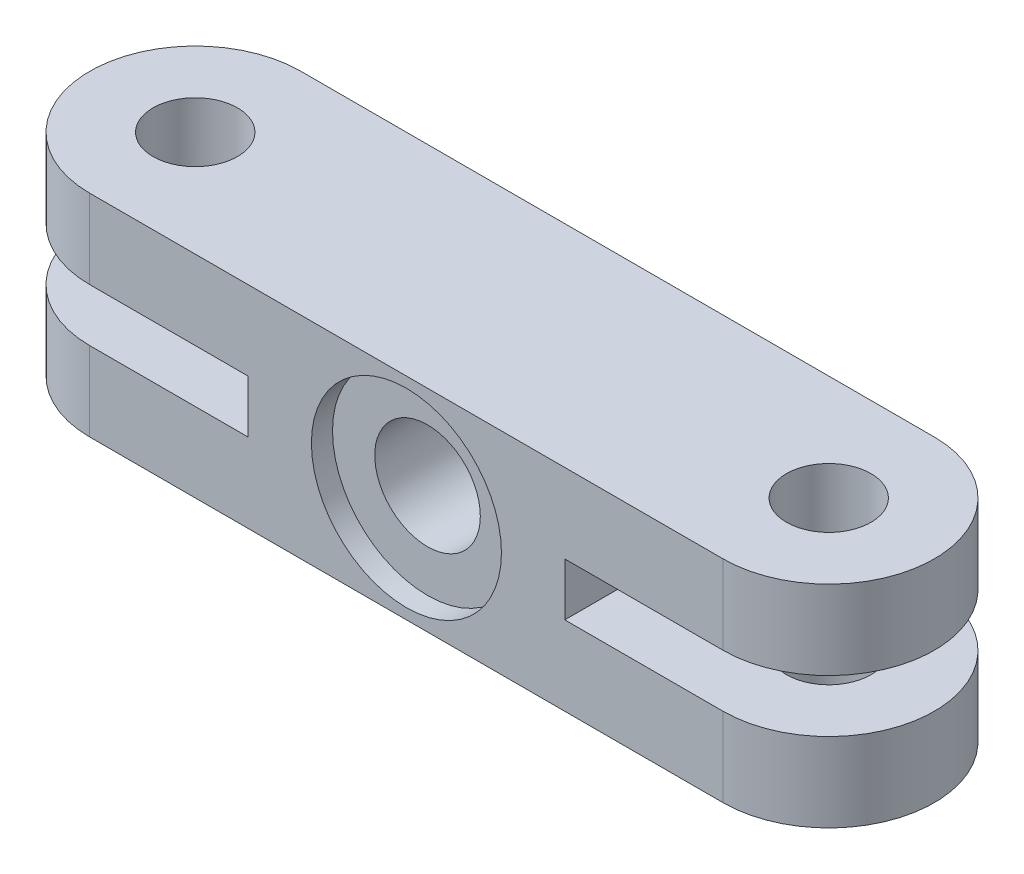
ISO-10303-21;
HEADER;
FILE_DESCRIPTION(('STEP AP214'),'2;1');
FILE_NAME('part.step','',(''),(''),'','','');
FILE_SCHEMA(('AUTOMOTIVE_DESIGN { 1 0 10303 214 1 1 1 1 }'));
ENDSEC;
DATA;
#1=APPLICATION_CONTEXT('core data for automotive mechanical design processes');
#2=APPLICATION_PROTOCOL_DEFINITION('international standard','automotive_design',2000,#1);
#3=PRODUCT_CONTEXT('',#1,'mechanical');
#4=PRODUCT('Part','Part','',(#3));
#5=PRODUCT_RELATED_PRODUCT_CATEGORY('part','',(#4));
#6=PRODUCT_DEFINITION_FORMATION('','',#4);
#7=PRODUCT_DEFINITION_CONTEXT('part definition',#1,'design');
#8=PRODUCT_DEFINITION('design','',#6,#7);
#9=PRODUCT_DEFINITION_SHAPE('','',#8);
#10=(LENGTH_UNIT() NAMED_UNIT(*) SI_UNIT(.MILLI.,.METRE.));
#11=(NAMED_UNIT(*) PLANE_ANGLE_UNIT() SI_UNIT($,.RADIAN.));
#12=(NAMED_UNIT(*) SI_UNIT($,.STERADIAN.) SOLID_ANGLE_UNIT());
#13=UNCERTAINTY_MEASURE_WITH_UNIT(LENGTH_MEASURE(1.E-05),#10,'distance_accuracy_value','');
#14=(GEOMETRIC_REPRESENTATION_CONTEXT(3) GLOBAL_UNCERTAINTY_ASSIGNED_CONTEXT((#13)) GLOBAL_UNIT_ASSIGNED_CONTEXT((#10,
#11,#12)) REPRESENTATION_CONTEXT('',''));
#15=CARTESIAN_POINT('',(0.,0.,0.));
#16=DIRECTION('',(0.,0.,1.));
#17=DIRECTION('',(1.,0.,0.));
#18=AXIS2_PLACEMENT_3D('',#15,#16,#17);
#19=CARTESIAN_POINT('',(-30.,10.,10.));
#20=DIRECTION('',(0.,0.,-1.));
#21=DIRECTION('',(-1.,0.,0.));
#22=AXIS2_PLACEMENT_3D('',#19,#20,#21);
#23=PLANE('',#22);
#24=DIRECTION('',(0.,-1.,0.));
#25=VECTOR('',#24,1.);
#26=CARTESIAN_POINT('',(15.,2.5,10.));
#27=LINE('',#26,#25);
#28=CARTESIAN_POINT('',(15.,2.5,10.));
#29=VERTEX_POINT('',#28);
#30=CARTESIAN_POINT('',(15.,-2.5,10.));
#31=VERTEX_POINT('',#30);
#32=EDGE_CURVE('E140',#29,#31,#27,.T.);
#33=ORIENTED_EDGE('',*,*,#32,.F.);
#34=DIRECTION('',(-1.,0.,0.));
#35=VECTOR('',#34,1.);
#36=CARTESIAN_POINT('',(40.,2.5,10.));
#37=LINE('',#36,#35);
#38=CARTESIAN_POINT('',(30.,2.5,10.));
#39=VERTEX_POINT('',#38);
#40=EDGE_CURVE('E156',#39,#29,#37,.T.);
#41=ORIENTED_EDGE('',*,*,#40,.F.);
#42=DIRECTION('',(0.,-1.,0.));
#43=VECTOR('',#42,1.);
#44=CARTESIAN_POINT('',(30.,10.,10.));
#45=LINE('',#44,#43);
#46=CARTESIAN_POINT('',(30.,10.,10.));
#47=VERTEX_POINT('',#46);
#48=EDGE_CURVE('E269',#47,#39,#45,.T.);
#49=ORIENTED_EDGE('',*,*,#48,.F.);
#50=DIRECTION('',(1.,0.,0.));
#51=VECTOR('',#50,1.);
#52=CARTESIAN_POINT('',(-30.,10.,10.));
#53=LINE('',#52,#51);
#54=CARTESIAN_POINT('',(-30.,10.,10.));
#55=VERTEX_POINT('',#54);
#56=EDGE_CURVE('E235',#55,#47,#53,.T.);
#57=ORIENTED_EDGE('',*,*,#56,.F.);
#58=DIRECTION('',(0.,-1.,0.));
#59=VECTOR('',#58,1.);
#60=CARTESIAN_POINT('',(-30.,10.,10.));
#61=LINE('',#60,#59);
#62=CARTESIAN_POINT('',(-30.,2.5,10.));
#63=VERTEX_POINT('',#62);
#64=EDGE_CURVE('E11',#55,#63,#61,.T.);
#65=ORIENTED_EDGE('',*,*,#64,.T.);
#66=DIRECTION('',(-1.,0.,0.));
#67=VECTOR('',#66,1.);
#68=CARTESIAN_POINT('',(-40.,2.5,10.));
#69=LINE('',#68,#67);
#70=CARTESIAN_POINT('',(-15.,2.5,10.));
#71=VERTEX_POINT('',#70);
#72=EDGE_CURVE('E187',#71,#63,#69,.T.);
#73=ORIENTED_EDGE('',*,*,#72,.F.);
#74=DIRECTION('',(0.,1.,0.));
#75=VECTOR('',#74,1.);
#76=CARTESIAN_POINT('',(-15.,2.5,10.));
#77=LINE('',#76,#75);
#78=CARTESIAN_POINT('',(-15.,-2.5,10.));
#79=VERTEX_POINT('',#78);
#80=EDGE_CURVE('E180',#79,#71,#77,.T.);
#81=ORIENTED_EDGE('',*,*,#80,.F.);
#82=DIRECTION('',(1.,0.,0.));
#83=VECTOR('',#82,1.);
#84=CARTESIAN_POINT('',(-40.,-2.5,10.));
#85=LINE('',#84,#83);
#86=CARTESIAN_POINT('',(-30.,-2.5,10.));
#87=VERTEX_POINT('',#86);
#88=EDGE_CURVE('E191',#87,#79,#85,.T.);
#89=ORIENTED_EDGE('',*,*,#88,.F.);
#90=CARTESIAN_POINT('',(-30.,-10.,10.));
#91=VERTEX_POINT('',#90);
#92=EDGE_CURVE('E49',#87,#91,#61,.T.);
#93=ORIENTED_EDGE('',*,*,#92,.T.);
#94=DIRECTION('',(1.,0.,0.));
#95=VECTOR('',#94,1.);
#96=CARTESIAN_POINT('',(-30.,-10.,10.));
#97=LINE('',#96,#95);
#98=CARTESIAN_POINT('',(30.,-10.,10.));
#99=VERTEX_POINT('',#98);
#100=EDGE_CURVE('E249',#91,#99,#97,.T.);
#101=ORIENTED_EDGE('',*,*,#100,.T.);
#102=CARTESIAN_POINT('',(30.,-2.5,10.));
#103=VERTEX_POINT('',#102);
#104=EDGE_CURVE('E268',#103,#99,#45,.T.);
#105=ORIENTED_EDGE('',*,*,#104,.F.);
#106=DIRECTION('',(1.,0.,0.));
#107=VECTOR('',#106,1.);
#108=CARTESIAN_POINT('',(40.,-2.5,10.));
#109=LINE('',#108,#107);
#110=EDGE_CURVE('E159',#31,#103,#109,.T.);
#111=ORIENTED_EDGE('',*,*,#110,.F.);
#112=EDGE_LOOP('',(#33,#41,#49,#57,#65,#73,#81,#89,#93,#101,#105,#111));
#113=FACE_BOUND('',#112,.T.);
#114=CARTESIAN_POINT('',(0.,0.,10.));
#115=DIRECTION('',(0.,0.,1.));
#116=DIRECTION('',(1.,0.,0.));
#117=AXIS2_PLACEMENT_3D('',#114,#115,#116);
#118=CIRCLE('',#117,9.00000000000001);
#119=CARTESIAN_POINT('',(9.00000000000001,0.,10.));
#120=VERTEX_POINT('',#119);
#121=EDGE_CURVE('E507',#120,#120,#118,.T.);
#122=ORIENTED_EDGE('',*,*,#121,.F.);
#123=EDGE_LOOP('',(#122));
#124=FACE_BOUND('',#123,.T.);
#125=ADVANCED_FACE('F39',(#113,#124),#23,.F.);
#126=CARTESIAN_POINT('',(-30.,10.,0.));
#127=DIRECTION('',(0.,-1.,0.));
#128=DIRECTION('',(0.,0.,-1.));
#129=AXIS2_PLACEMENT_3D('',#126,#127,#128);
#130=CYLINDRICAL_SURFACE('',#129,10.);
#131=CARTESIAN_POINT('',(-30.,2.5,0.));
#132=DIRECTION('',(0.,1.,0.));
#133=DIRECTION('',(-1.,0.,0.));
#134=AXIS2_PLACEMENT_3D('',#131,#132,#133);
#135=CIRCLE('',#134,10.);
#136=CARTESIAN_POINT('',(-30.,2.5,-10.));
#137=VERTEX_POINT('',#136);
#138=EDGE_CURVE('E211',#137,#63,#135,.T.);
#139=ORIENTED_EDGE('',*,*,#138,.T.);
#140=ORIENTED_EDGE('',*,*,#64,.F.);
#141=CARTESIAN_POINT('',(-30.,10.,0.));
#142=DIRECTION('',(0.,1.,0.));
#143=DIRECTION('',(0.,0.,1.));
#144=AXIS2_PLACEMENT_3D('',#141,#142,#143);
#145=CIRCLE('',#144,10.);
#146=CARTESIAN_POINT('',(-30.,10.,-10.));
#147=VERTEX_POINT('',#146);
#148=EDGE_CURVE('E231',#147,#55,#145,.T.);
#149=ORIENTED_EDGE('',*,*,#148,.F.);
#150=DIRECTION('',(0.,-1.,0.));
#151=VECTOR('',#150,1.);
#152=CARTESIAN_POINT('',(-30.,10.,-10.));
#153=LINE('',#152,#151);
#154=EDGE_CURVE('E260',#147,#137,#153,.T.);
#155=ORIENTED_EDGE('',*,*,#154,.T.);
#156=EDGE_LOOP('',(#139,#140,#149,#155));
#157=FACE_BOUND('',#156,.T.);
#158=ADVANCED_FACE('F316',(#157),#130,.T.);
#159=CARTESIAN_POINT('',(30.,10.,0.));
#160=DIRECTION('',(0.,-1.,0.));
#161=DIRECTION('',(0.,0.,-1.));
#162=AXIS2_PLACEMENT_3D('',#159,#160,#161);
#163=CYLINDRICAL_SURFACE('',#162,10.);
#164=ORIENTED_EDGE('',*,*,#48,.T.);
#165=CARTESIAN_POINT('',(30.,2.5,0.));
#166=DIRECTION('',(0.,1.,0.));
#167=DIRECTION('',(-1.,0.,0.));
#168=AXIS2_PLACEMENT_3D('',#165,#166,#167);
#169=CIRCLE('',#168,10.);
#170=CARTESIAN_POINT('',(30.,2.5,-10.));
#171=VERTEX_POINT('',#170);
#172=EDGE_CURVE('E204',#39,#171,#169,.T.);
#173=ORIENTED_EDGE('',*,*,#172,.T.);
#174=DIRECTION('',(0.,-1.,0.));
#175=VECTOR('',#174,1.);
#176=CARTESIAN_POINT('',(30.,10.,-10.));
#177=LINE('',#176,#175);
#178=CARTESIAN_POINT('',(30.,10.,-10.));
#179=VERTEX_POINT('',#178);
#180=EDGE_CURVE('E265',#179,#171,#177,.T.);
#181=ORIENTED_EDGE('',*,*,#180,.F.);
#182=CARTESIAN_POINT('',(30.,10.,0.));
#183=DIRECTION('',(0.,1.,0.));
#184=DIRECTION('',(0.,0.,1.));
#185=AXIS2_PLACEMENT_3D('',#182,#183,#184);
#186=CIRCLE('',#185,10.);
#187=EDGE_CURVE('E239',#47,#179,#186,.T.);
#188=ORIENTED_EDGE('',*,*,#187,.F.);
#189=EDGE_LOOP('',(#164,#173,#181,#188));
#190=FACE_BOUND('',#189,.T.);
#191=ADVANCED_FACE('F321',(#190),#163,.T.);
#192=CARTESIAN_POINT('',(-30.,10.,0.));
#193=DIRECTION('',(0.,-1.,0.));
#194=DIRECTION('',(0.,0.,-1.));
#195=AXIS2_PLACEMENT_3D('',#192,#193,#194);
#196=CYLINDRICAL_SURFACE('',#195,4.);
#197=CARTESIAN_POINT('',(-30.,2.5,0.));
#198=DIRECTION('',(0.,1.,0.));
#199=DIRECTION('',(-1.,0.,0.));
#200=AXIS2_PLACEMENT_3D('',#197,#198,#199);
#201=CIRCLE('',#200,4.);
#202=CARTESIAN_POINT('',(-34.,2.5,0.));
#203=VERTEX_POINT('',#202);
#204=EDGE_CURVE('E43',#203,#203,#201,.T.);
#205=ORIENTED_EDGE('',*,*,#204,.F.);
#206=EDGE_LOOP('',(#205));
#207=FACE_BOUND('',#206,.T.);
#208=CARTESIAN_POINT('',(-30.,10.,0.));
#209=DIRECTION('',(0.,1.,0.));
#210=DIRECTION('',(0.,0.,1.));
#211=AXIS2_PLACEMENT_3D('',#208,#209,#210);
#212=CIRCLE('',#211,4.);
#213=CARTESIAN_POINT('',(-30.,10.,4.));
#214=VERTEX_POINT('',#213);
#215=EDGE_CURVE('E223',#214,#214,#212,.T.);
#216=ORIENTED_EDGE('',*,*,#215,.T.);
#217=EDGE_LOOP('',(#216));
#218=FACE_BOUND('',#217,.T.);
#219=ADVANCED_FACE('F290',(#207,#218),#196,.F.);
#220=CARTESIAN_POINT('',(30.,10.,0.));
#221=DIRECTION('',(0.,-1.,0.));
#222=DIRECTION('',(0.,0.,-1.));
#223=AXIS2_PLACEMENT_3D('',#220,#221,#222);
#224=CYLINDRICAL_SURFACE('',#223,4.00000000000001);
#225=CARTESIAN_POINT('',(30.,2.5,0.));
#226=DIRECTION('',(0.,1.,0.));
#227=DIRECTION('',(-1.,0.,0.));
#228=AXIS2_PLACEMENT_3D('',#225,#226,#227);
#229=CIRCLE('',#228,4.00000000000001);
#230=CARTESIAN_POINT('',(26.,2.5,0.));
#231=VERTEX_POINT('',#230);
#232=EDGE_CURVE('E203',#231,#231,#229,.T.);
#233=ORIENTED_EDGE('',*,*,#232,.F.);
#234=EDGE_LOOP('',(#233));
#235=FACE_BOUND('',#234,.T.);
#236=CARTESIAN_POINT('',(30.,10.,0.));
#237=DIRECTION('',(0.,1.,0.));
#238=DIRECTION('',(0.,0.,1.));
#239=AXIS2_PLACEMENT_3D('',#236,#237,#238);
#240=CIRCLE('',#239,4.00000000000001);
#241=CARTESIAN_POINT('',(30.,10.,4.00000000000001));
#242=VERTEX_POINT('',#241);
#243=EDGE_CURVE('E215',#242,#242,#240,.T.);
#244=ORIENTED_EDGE('',*,*,#243,.T.);
#245=EDGE_LOOP('',(#244));
#246=FACE_BOUND('',#245,.T.);
#247=ADVANCED_FACE('F305',(#235,#246),#224,.F.);
#248=CARTESIAN_POINT('',(-30.,10.,0.));
#249=DIRECTION('',(0.,1.,0.));
#250=DIRECTION('',(0.,0.,1.));
#251=AXIS2_PLACEMENT_3D('',#248,#249,#250);
#252=PLANE('',#251);
#253=ORIENTED_EDGE('',*,*,#215,.F.);
#254=EDGE_LOOP('',(#253));
#255=FACE_BOUND('',#254,.T.);
#256=ORIENTED_EDGE('',*,*,#148,.T.);
#257=ORIENTED_EDGE('',*,*,#56,.T.);
#258=ORIENTED_EDGE('',*,*,#187,.T.);
#259=DIRECTION('',(-1.,0.,0.));
#260=VECTOR('',#259,1.);
#261=CARTESIAN_POINT('',(-30.,10.,-10.));
#262=LINE('',#261,#260);
#263=EDGE_CURVE('E242',#179,#147,#262,.T.);
#264=ORIENTED_EDGE('',*,*,#263,.T.);
#265=EDGE_LOOP('',(#256,#257,#258,#264));
#266=FACE_BOUND('',#265,.T.);
#267=ORIENTED_EDGE('',*,*,#243,.F.);
#268=EDGE_LOOP('',(#267));
#269=FACE_BOUND('',#268,.T.);
#270=ADVANCED_FACE('F296',(#255,#266,#269),#252,.T.);
#271=CARTESIAN_POINT('',(-30.,-10.,0.));
#272=DIRECTION('',(0.,1.,0.));
#273=DIRECTION('',(0.,0.,1.));
#274=AXIS2_PLACEMENT_3D('',#271,#272,#273);
#275=PLANE('',#274);
#276=CARTESIAN_POINT('',(-30.,-10.,0.));
#277=DIRECTION('',(0.,1.,0.));
#278=DIRECTION('',(0.,0.,1.));
#279=AXIS2_PLACEMENT_3D('',#276,#277,#278);
#280=CIRCLE('',#279,10.);
#281=CARTESIAN_POINT('',(-30.,-10.,-10.));
#282=VERTEX_POINT('',#281);
#283=EDGE_CURVE('E227',#282,#91,#280,.T.);
#284=ORIENTED_EDGE('',*,*,#283,.F.);
#285=DIRECTION('',(-1.,0.,0.));
#286=VECTOR('',#285,1.);
#287=CARTESIAN_POINT('',(-30.,-10.,-10.));
#288=LINE('',#287,#286);
#289=CARTESIAN_POINT('',(30.,-10.,-10.));
#290=VERTEX_POINT('',#289);
#291=EDGE_CURVE('E236',#290,#282,#288,.T.);
#292=ORIENTED_EDGE('',*,*,#291,.F.);
#293=CARTESIAN_POINT('',(30.,-10.,0.));
#294=DIRECTION('',(0.,1.,0.));
#295=DIRECTION('',(0.,0.,1.));
#296=AXIS2_PLACEMENT_3D('',#293,#294,#295);
#297=CIRCLE('',#296,10.);
#298=EDGE_CURVE('E253',#99,#290,#297,.T.);
#299=ORIENTED_EDGE('',*,*,#298,.F.);
#300=ORIENTED_EDGE('',*,*,#100,.F.);
#301=EDGE_LOOP('',(#284,#292,#299,#300));
#302=FACE_BOUND('',#301,.T.);
#303=CARTESIAN_POINT('',(-30.,-10.,0.));
#304=DIRECTION('',(0.,1.,0.));
#305=DIRECTION('',(0.,0.,1.));
#306=AXIS2_PLACEMENT_3D('',#303,#304,#305);
#307=CIRCLE('',#306,4.);
#308=CARTESIAN_POINT('',(-30.,-10.,4.));
#309=VERTEX_POINT('',#308);
#310=EDGE_CURVE('E219',#309,#309,#307,.T.);
#311=ORIENTED_EDGE('',*,*,#310,.T.);
#312=EDGE_LOOP('',(#311));
#313=FACE_BOUND('',#312,.T.);
#314=CARTESIAN_POINT('',(30.,-10.,0.));
#315=DIRECTION('',(0.,1.,0.));
#316=DIRECTION('',(0.,0.,1.));
#317=AXIS2_PLACEMENT_3D('',#314,#315,#316);
#318=CIRCLE('',#317,4.00000000000001);
#319=CARTESIAN_POINT('',(30.,-10.,4.00000000000001));
#320=VERTEX_POINT('',#319);
#321=EDGE_CURVE('E214',#320,#320,#318,.T.);
#322=ORIENTED_EDGE('',*,*,#321,.T.);
#323=EDGE_LOOP('',(#322));
#324=FACE_BOUND('',#323,.T.);
#325=ADVANCED_FACE('F293',(#302,#313,#324),#275,.F.);
#326=ORIENTED_EDGE('',*,*,#92,.F.);
#327=CARTESIAN_POINT('',(-30.,-2.5,0.));
#328=DIRECTION('',(0.,-1.,0.));
#329=DIRECTION('',(1.,0.,0.));
#330=AXIS2_PLACEMENT_3D('',#327,#328,#329);
#331=CIRCLE('',#330,10.);
#332=CARTESIAN_POINT('',(-30.,-2.5,-10.));
#333=VERTEX_POINT('',#332);
#334=EDGE_CURVE('E208',#87,#333,#331,.T.);
#335=ORIENTED_EDGE('',*,*,#334,.T.);
#336=EDGE_CURVE('E245',#333,#282,#153,.T.);
#337=ORIENTED_EDGE('',*,*,#336,.T.);
#338=ORIENTED_EDGE('',*,*,#283,.T.);
#339=EDGE_LOOP('',(#326,#335,#337,#338));
#340=FACE_BOUND('',#339,.T.);
#341=ADVANCED_FACE('F41',(#340),#130,.T.);
#342=CARTESIAN_POINT('',(30.,-2.5,0.));
#343=DIRECTION('',(0.,-1.,0.));
#344=DIRECTION('',(1.,0.,0.));
#345=AXIS2_PLACEMENT_3D('',#342,#343,#344);
#346=CIRCLE('',#345,10.);
#347=CARTESIAN_POINT('',(30.,-2.5,-10.));
#348=VERTEX_POINT('',#347);
#349=EDGE_CURVE('E65',#348,#103,#346,.T.);
#350=ORIENTED_EDGE('',*,*,#349,.T.);
#351=ORIENTED_EDGE('',*,*,#104,.T.);
#352=ORIENTED_EDGE('',*,*,#298,.T.);
#353=EDGE_CURVE('E264',#348,#290,#177,.T.);
#354=ORIENTED_EDGE('',*,*,#353,.F.);
#355=EDGE_LOOP('',(#350,#351,#352,#354));
#356=FACE_BOUND('',#355,.T.);
#357=ADVANCED_FACE('F325',(#356),#163,.T.);
#358=CARTESIAN_POINT('',(-30.,10.,-10.));
#359=DIRECTION('',(0.,0.,1.));
#360=DIRECTION('',(1.,0.,0.));
#361=AXIS2_PLACEMENT_3D('',#358,#359,#360);
#362=PLANE('',#361);
#363=CARTESIAN_POINT('',(0.,0.,-10.));
#364=DIRECTION('',(0.,0.,1.));
#365=DIRECTION('',(1.,0.,0.));
#366=AXIS2_PLACEMENT_3D('',#363,#364,#365);
#367=CIRCLE('',#366,5.00000000000001);
#368=CARTESIAN_POINT('',(5.00000000000001,0.,-10.));
#369=VERTEX_POINT('',#368);
#370=EDGE_CURVE('E162',#369,#369,#367,.T.);
#371=ORIENTED_EDGE('',*,*,#370,.T.);
#372=EDGE_LOOP('',(#371));
#373=FACE_BOUND('',#372,.T.);
#374=ORIENTED_EDGE('',*,*,#180,.T.);
#375=DIRECTION('',(-1.,0.,0.));
#376=VECTOR('',#375,1.);
#377=CARTESIAN_POINT('',(40.,2.5,-10.));
#378=LINE('',#377,#376);
#379=CARTESIAN_POINT('',(15.,2.5,-10.));
#380=VERTEX_POINT('',#379);
#381=EDGE_CURVE('E144',#171,#380,#378,.T.);
#382=ORIENTED_EDGE('',*,*,#381,.T.);
#383=DIRECTION('',(0.,-1.,0.));
#384=VECTOR('',#383,1.);
#385=CARTESIAN_POINT('',(15.,2.5,-10.));
#386=LINE('',#385,#384);
#387=CARTESIAN_POINT('',(15.,-2.5,-10.));
#388=VERTEX_POINT('',#387);
#389=EDGE_CURVE('E137',#380,#388,#386,.T.);
#390=ORIENTED_EDGE('',*,*,#389,.T.);
#391=DIRECTION('',(1.,0.,0.));
#392=VECTOR('',#391,1.);
#393=CARTESIAN_POINT('',(40.,-2.5,-10.));
#394=LINE('',#393,#392);
#395=EDGE_CURVE('E146',#388,#348,#394,.T.);
#396=ORIENTED_EDGE('',*,*,#395,.T.);
#397=ORIENTED_EDGE('',*,*,#353,.T.);
#398=ORIENTED_EDGE('',*,*,#291,.T.);
#399=ORIENTED_EDGE('',*,*,#336,.F.);
#400=DIRECTION('',(1.,0.,0.));
#401=VECTOR('',#400,1.);
#402=CARTESIAN_POINT('',(-40.,-2.5,-10.));
#403=LINE('',#402,#401);
#404=CARTESIAN_POINT('',(-15.,-2.5,-10.));
#405=VERTEX_POINT('',#404);
#406=EDGE_CURVE('E179',#333,#405,#403,.T.);
#407=ORIENTED_EDGE('',*,*,#406,.T.);
#408=DIRECTION('',(0.,1.,0.));
#409=VECTOR('',#408,1.);
#410=CARTESIAN_POINT('',(-15.,2.5,-10.));
#411=LINE('',#410,#409);
#412=CARTESIAN_POINT('',(-15.,2.5,-10.));
#413=VERTEX_POINT('',#412);
#414=EDGE_CURVE('E57',#405,#413,#411,.T.);
#415=ORIENTED_EDGE('',*,*,#414,.T.);
#416=DIRECTION('',(-1.,0.,0.));
#417=VECTOR('',#416,1.);
#418=CARTESIAN_POINT('',(-40.,2.5,-10.));
#419=LINE('',#418,#417);
#420=EDGE_CURVE('E175',#413,#137,#419,.T.);
#421=ORIENTED_EDGE('',*,*,#420,.T.);
#422=ORIENTED_EDGE('',*,*,#154,.F.);
#423=ORIENTED_EDGE('',*,*,#263,.F.);
#424=EDGE_LOOP('',(#374,#382,#390,#396,#397,#398,#399,#407,#415,#421,#422,#423));
#425=FACE_BOUND('',#424,.T.);
#426=ADVANCED_FACE('F153',(#373,#425),#362,.F.);
#427=CARTESIAN_POINT('',(-30.,-2.5,0.));
#428=DIRECTION('',(0.,-1.,0.));
#429=DIRECTION('',(1.,0.,0.));
#430=AXIS2_PLACEMENT_3D('',#427,#428,#429);
#431=CIRCLE('',#430,4.);
#432=CARTESIAN_POINT('',(-26.,-2.5,0.));
#433=VERTEX_POINT('',#432);
#434=EDGE_CURVE('E207',#433,#433,#431,.T.);
#435=ORIENTED_EDGE('',*,*,#434,.F.);
#436=EDGE_LOOP('',(#435));
#437=FACE_BOUND('',#436,.T.);
#438=ORIENTED_EDGE('',*,*,#310,.F.);
#439=EDGE_LOOP('',(#438));
#440=FACE_BOUND('',#439,.T.);
#441=ADVANCED_FACE('F285',(#437,#440),#196,.F.);
#442=CARTESIAN_POINT('',(30.,-2.5,0.));
#443=DIRECTION('',(0.,-1.,0.));
#444=DIRECTION('',(1.,0.,0.));
#445=AXIS2_PLACEMENT_3D('',#442,#443,#444);
#446=CIRCLE('',#445,4.00000000000001);
#447=CARTESIAN_POINT('',(34.,-2.5,0.));
#448=VERTEX_POINT('',#447);
#449=EDGE_CURVE('E173',#448,#448,#446,.T.);
#450=ORIENTED_EDGE('',*,*,#449,.F.);
#451=EDGE_LOOP('',(#450));
#452=FACE_BOUND('',#451,.T.);
#453=ORIENTED_EDGE('',*,*,#321,.F.);
#454=EDGE_LOOP('',(#453));
#455=FACE_BOUND('',#454,.T.);
#456=ADVANCED_FACE('F288',(#452,#455),#224,.F.);
#457=CARTESIAN_POINT('',(40.,2.5,-10.));
#458=DIRECTION('',(0.,1.,0.));
#459=DIRECTION('',(-1.,0.,0.));
#460=AXIS2_PLACEMENT_3D('',#457,#458,#459);
#461=PLANE('',#460);
#462=ORIENTED_EDGE('',*,*,#232,.T.);
#463=EDGE_LOOP('',(#462));
#464=FACE_BOUND('',#463,.T.);
#465=ORIENTED_EDGE('',*,*,#40,.T.);
#466=DIRECTION('',(0.,0.,1.));
#467=VECTOR('',#466,1.);
#468=CARTESIAN_POINT('',(15.,2.5,-10.));
#469=LINE('',#468,#467);
#470=EDGE_CURVE('E143',#380,#29,#469,.T.);
#471=ORIENTED_EDGE('',*,*,#470,.F.);
#472=ORIENTED_EDGE('',*,*,#381,.F.);
#473=ORIENTED_EDGE('',*,*,#172,.F.);
#474=EDGE_LOOP('',(#465,#471,#472,#473));
#475=FACE_BOUND('',#474,.T.);
#476=ADVANCED_FACE('F302',(#464,#475),#461,.F.);
#477=CARTESIAN_POINT('',(40.,-2.5,-10.));
#478=DIRECTION('',(0.,-1.,0.));
#479=DIRECTION('',(1.,0.,0.));
#480=AXIS2_PLACEMENT_3D('',#477,#478,#479);
#481=PLANE('',#480);
#482=ORIENTED_EDGE('',*,*,#449,.T.);
#483=EDGE_LOOP('',(#482));
#484=FACE_BOUND('',#483,.T.);
#485=ORIENTED_EDGE('',*,*,#349,.F.);
#486=ORIENTED_EDGE('',*,*,#395,.F.);
#487=DIRECTION('',(0.,0.,1.));
#488=VECTOR('',#487,1.);
#489=CARTESIAN_POINT('',(15.,-2.5,-10.));
#490=LINE('',#489,#488);
#491=EDGE_CURVE('E133',#388,#31,#490,.T.);
#492=ORIENTED_EDGE('',*,*,#491,.T.);
#493=ORIENTED_EDGE('',*,*,#110,.T.);
#494=EDGE_LOOP('',(#485,#486,#492,#493));
#495=FACE_BOUND('',#494,.T.);
#496=ADVANCED_FACE('F147',(#484,#495),#481,.F.);
#497=CARTESIAN_POINT('',(15.,2.5,-10.));
#498=DIRECTION('',(-1.,0.,0.));
#499=DIRECTION('',(0.,-1.,0.));
#500=AXIS2_PLACEMENT_3D('',#497,#498,#499);
#501=PLANE('',#500);
#502=ORIENTED_EDGE('',*,*,#32,.T.);
#503=ORIENTED_EDGE('',*,*,#491,.F.);
#504=ORIENTED_EDGE('',*,*,#389,.F.);
#505=ORIENTED_EDGE('',*,*,#470,.T.);
#506=EDGE_LOOP('',(#502,#503,#504,#505));
#507=FACE_BOUND('',#506,.T.);
#508=ADVANCED_FACE('F134',(#507),#501,.F.);
#509=CARTESIAN_POINT('',(-40.,2.5,-10.));
#510=DIRECTION('',(0.,1.,0.));
#511=DIRECTION('',(-1.,0.,0.));
#512=AXIS2_PLACEMENT_3D('',#509,#510,#511);
#513=PLANE('',#512);
#514=ORIENTED_EDGE('',*,*,#204,.T.);
#515=EDGE_LOOP('',(#514));
#516=FACE_BOUND('',#515,.T.);
#517=ORIENTED_EDGE('',*,*,#138,.F.);
#518=ORIENTED_EDGE('',*,*,#420,.F.);
#519=DIRECTION('',(0.,0.,1.));
#520=VECTOR('',#519,1.);
#521=CARTESIAN_POINT('',(-15.,2.5,-10.));
#522=LINE('',#521,#520);
#523=EDGE_CURVE('E169',#413,#71,#522,.T.);
#524=ORIENTED_EDGE('',*,*,#523,.T.);
#525=ORIENTED_EDGE('',*,*,#72,.T.);
#526=EDGE_LOOP('',(#517,#518,#524,#525));
#527=FACE_BOUND('',#526,.T.);
#528=ADVANCED_FACE('F354',(#516,#527),#513,.F.);
#529=CARTESIAN_POINT('',(-40.,-2.5,-10.));
#530=DIRECTION('',(0.,-1.,0.));
#531=DIRECTION('',(1.,0.,0.));
#532=AXIS2_PLACEMENT_3D('',#529,#530,#531);
#533=PLANE('',#532);
#534=ORIENTED_EDGE('',*,*,#434,.T.);
#535=EDGE_LOOP('',(#534));
#536=FACE_BOUND('',#535,.T.);
#537=ORIENTED_EDGE('',*,*,#88,.T.);
#538=DIRECTION('',(0.,0.,1.));
#539=VECTOR('',#538,1.);
#540=CARTESIAN_POINT('',(-15.,-2.5,-10.));
#541=LINE('',#540,#539);
#542=EDGE_CURVE('E186',#405,#79,#541,.T.);
#543=ORIENTED_EDGE('',*,*,#542,.F.);
#544=ORIENTED_EDGE('',*,*,#406,.F.);
#545=ORIENTED_EDGE('',*,*,#334,.F.);
#546=EDGE_LOOP('',(#537,#543,#544,#545));
#547=FACE_BOUND('',#546,.T.);
#548=ADVANCED_FACE('F282',(#536,#547),#533,.F.);
#549=CARTESIAN_POINT('',(-15.,2.5,-10.));
#550=DIRECTION('',(1.,0.,0.));
#551=DIRECTION('',(0.,1.,0.));
#552=AXIS2_PLACEMENT_3D('',#549,#550,#551);
#553=PLANE('',#552);
#554=ORIENTED_EDGE('',*,*,#80,.T.);
#555=ORIENTED_EDGE('',*,*,#523,.F.);
#556=ORIENTED_EDGE('',*,*,#414,.F.);
#557=ORIENTED_EDGE('',*,*,#542,.T.);
#558=EDGE_LOOP('',(#554,#555,#556,#557));
#559=FACE_BOUND('',#558,.T.);
#560=ADVANCED_FACE('F355',(#559),#553,.F.);
#561=CARTESIAN_POINT('',(0.,0.,10.));
#562=DIRECTION('',(0.,0.,1.));
#563=DIRECTION('',(1.,0.,0.));
#564=AXIS2_PLACEMENT_3D('',#561,#562,#563);
#565=CYLINDRICAL_SURFACE('',#564,5.00000000000001);
#566=ORIENTED_EDGE('',*,*,#370,.F.);
#567=EDGE_LOOP('',(#566));
#568=FACE_BOUND('',#567,.T.);
#569=CARTESIAN_POINT('',(0.,0.,8.));
#570=DIRECTION('',(0.,0.,1.));
#571=DIRECTION('',(1.,0.,0.));
#572=AXIS2_PLACEMENT_3D('',#569,#570,#571);
#573=CIRCLE('',#572,5.00000000000001);
#574=CARTESIAN_POINT('',(5.00000000000001,0.,8.));
#575=VERTEX_POINT('',#574);
#576=EDGE_CURVE('E511',#575,#575,#573,.T.);
#577=ORIENTED_EDGE('',*,*,#576,.T.);
#578=EDGE_LOOP('',(#577));
#579=FACE_BOUND('',#578,.T.);
#580=ADVANCED_FACE('F464',(#568,#579),#565,.F.);
#581=CARTESIAN_POINT('',(5.00000000000001,0.,8.));
#582=DIRECTION('',(0.,0.,-1.));
#583=DIRECTION('',(-1.,0.,0.));
#584=AXIS2_PLACEMENT_3D('',#581,#582,#583);
#585=PLANE('',#584);
#586=ORIENTED_EDGE('',*,*,#576,.F.);
#587=EDGE_LOOP('',(#586));
#588=FACE_BOUND('',#587,.T.);
#589=CARTESIAN_POINT('',(0.,0.,8.));
#590=DIRECTION('',(0.,0.,1.));
#591=DIRECTION('',(1.,0.,0.));
#592=AXIS2_PLACEMENT_3D('',#589,#590,#591);
#593=CIRCLE('',#592,9.00000000000001);
#594=CARTESIAN_POINT('',(9.00000000000001,0.,8.));
#595=VERTEX_POINT('',#594);
#596=EDGE_CURVE('E504',#595,#595,#593,.T.);
#597=ORIENTED_EDGE('',*,*,#596,.T.);
#598=EDGE_LOOP('',(#597));
#599=FACE_BOUND('',#598,.T.);
#600=ADVANCED_FACE('F478',(#588,#599),#585,.F.);
#601=CARTESIAN_POINT('',(0.,0.,10.));
#602=DIRECTION('',(0.,0.,1.));
#603=DIRECTION('',(1.,0.,0.));
#604=AXIS2_PLACEMENT_3D('',#601,#602,#603);
#605=CYLINDRICAL_SURFACE('',#604,9.00000000000001);
#606=ORIENTED_EDGE('',*,*,#596,.F.);
#607=EDGE_LOOP('',(#606));
#608=FACE_BOUND('',#607,.T.);
#609=ORIENTED_EDGE('',*,*,#121,.T.);
#610=EDGE_LOOP('',(#609));
#611=FACE_BOUND('',#610,.T.);
#612=ADVANCED_FACE('F487',(#608,#611),#605,.F.);
#613=CLOSED_SHELL('',(#125,#158,#191,#219,#247,#270,#325,#341,#357,#426,#441,#456,#476,#496,
#508,#528,#548,#560,#580,#600,#612));
#614=MANIFOLD_SOLID_BREP('B2',#613);
#615=ADVANCED_BREP_SHAPE_REPRESENTATION('',(#18,#614),#14);
#616=SHAPE_DEFINITION_REPRESENTATION(#9,#615);
ENDSEC;
END-ISO-10303-21;
